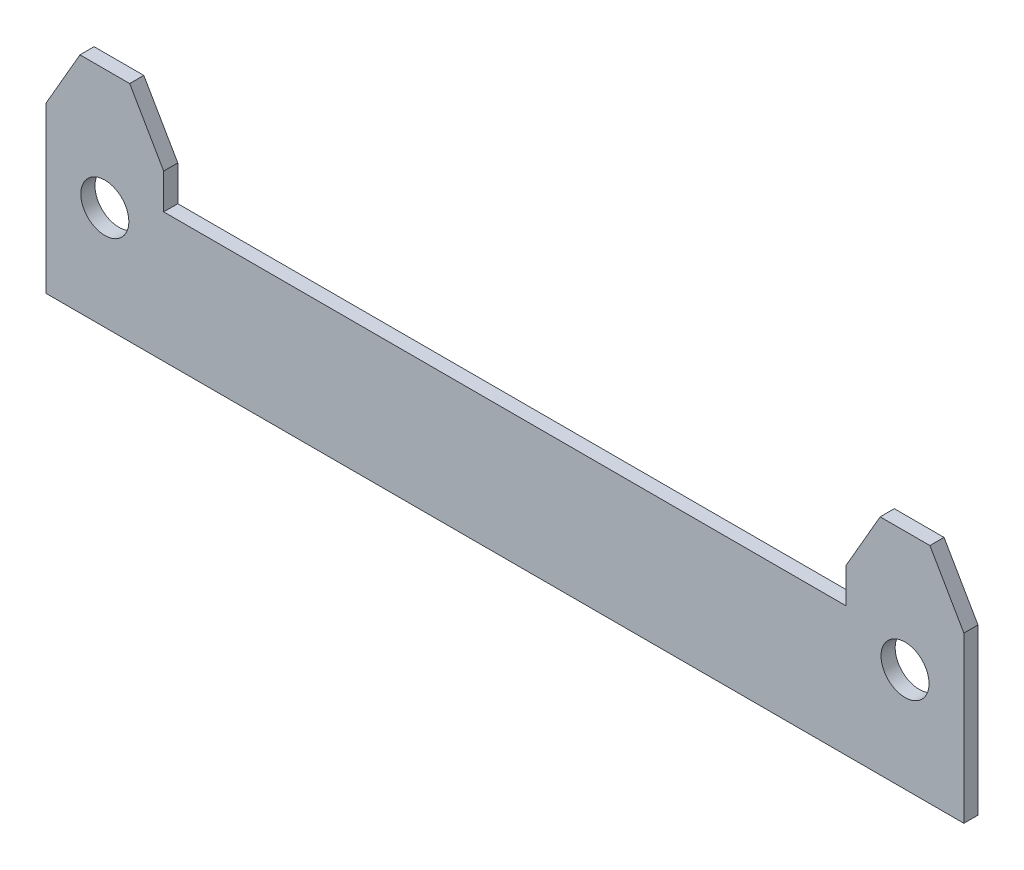
ISO-10303-21;
HEADER;
FILE_DESCRIPTION(('STEP AP214'),'2;1');
FILE_NAME('part.step','',(''),(''),'','','');
FILE_SCHEMA(('AUTOMOTIVE_DESIGN { 1 0 10303 214 1 1 1 1 }'));
ENDSEC;
DATA;
#1=APPLICATION_CONTEXT('core data for automotive mechanical design processes');
#2=APPLICATION_PROTOCOL_DEFINITION('international standard','automotive_design',2000,#1);
#3=PRODUCT_CONTEXT('',#1,'mechanical');
#4=PRODUCT('Part','Part','',(#3));
#5=PRODUCT_RELATED_PRODUCT_CATEGORY('part','',(#4));
#6=PRODUCT_DEFINITION_FORMATION('','',#4);
#7=PRODUCT_DEFINITION_CONTEXT('part definition',#1,'design');
#8=PRODUCT_DEFINITION('design','',#6,#7);
#9=PRODUCT_DEFINITION_SHAPE('','',#8);
#10=(LENGTH_UNIT() NAMED_UNIT(*) SI_UNIT(.MILLI.,.METRE.));
#11=(NAMED_UNIT(*) PLANE_ANGLE_UNIT() SI_UNIT($,.RADIAN.));
#12=(NAMED_UNIT(*) SI_UNIT($,.STERADIAN.) SOLID_ANGLE_UNIT());
#13=UNCERTAINTY_MEASURE_WITH_UNIT(LENGTH_MEASURE(1.E-05),#10,'distance_accuracy_value','');
#14=(GEOMETRIC_REPRESENTATION_CONTEXT(3) GLOBAL_UNCERTAINTY_ASSIGNED_CONTEXT((#13)) GLOBAL_UNIT_ASSIGNED_CONTEXT((#10,
#11,#12)) REPRESENTATION_CONTEXT('',''));
#15=CARTESIAN_POINT('',(0.,0.,0.));
#16=DIRECTION('',(0.,0.,1.));
#17=DIRECTION('',(1.,0.,0.));
#18=AXIS2_PLACEMENT_3D('',#15,#16,#17);
#19=CARTESIAN_POINT('',(0.,0.,3.));
#20=DIRECTION('',(0.,0.,-1.));
#21=DIRECTION('',(-1.,0.,0.));
#22=AXIS2_PLACEMENT_3D('',#19,#20,#21);
#23=PLANE('',#22);
#24=DIRECTION('',(0.,-1.,0.));
#25=VECTOR('',#24,1.);
#26=CARTESIAN_POINT('',(-97.5,0.,3.));
#27=LINE('',#26,#25);
#28=CARTESIAN_POINT('',(-97.5,35.,3.));
#29=VERTEX_POINT('',#28);
#30=CARTESIAN_POINT('',(-97.5,0.,3.));
#31=VERTEX_POINT('',#30);
#32=EDGE_CURVE('E178',#29,#31,#27,.T.);
#33=ORIENTED_EDGE('',*,*,#32,.T.);
#34=DIRECTION('',(1.,0.,0.));
#35=VECTOR('',#34,1.);
#36=CARTESIAN_POINT('',(97.5,0.,3.));
#37=LINE('',#36,#35);
#38=CARTESIAN_POINT('',(97.5,0.,3.));
#39=VERTEX_POINT('',#38);
#40=EDGE_CURVE('E106',#31,#39,#37,.T.);
#41=ORIENTED_EDGE('',*,*,#40,.T.);
#42=DIRECTION('',(0.,1.,0.));
#43=VECTOR('',#42,1.);
#44=CARTESIAN_POINT('',(97.5,0.,3.));
#45=LINE('',#44,#43);
#46=CARTESIAN_POINT('',(97.5,35.,3.));
#47=VERTEX_POINT('',#46);
#48=EDGE_CURVE('E205',#39,#47,#45,.T.);
#49=ORIENTED_EDGE('',*,*,#48,.T.);
#50=DIRECTION('',(-0.499999999999998,0.86602540378444,0.));
#51=VECTOR('',#50,1.);
#52=CARTESIAN_POINT('',(97.5,35.,3.));
#53=LINE('',#52,#51);
#54=CARTESIAN_POINT('',(90.2831216351297,47.5,3.));
#55=VERTEX_POINT('',#54);
#56=EDGE_CURVE('E224',#47,#55,#53,.T.);
#57=ORIENTED_EDGE('',*,*,#56,.T.);
#58=DIRECTION('',(-1.,0.,0.));
#59=VECTOR('',#58,1.);
#60=CARTESIAN_POINT('',(90.2831216351297,47.5,3.));
#61=LINE('',#60,#59);
#62=CARTESIAN_POINT('',(79.7168783648703,47.5,3.));
#63=VERTEX_POINT('',#62);
#64=EDGE_CURVE('E221',#55,#63,#61,.T.);
#65=ORIENTED_EDGE('',*,*,#64,.T.);
#66=DIRECTION('',(-0.499999999999998,-0.86602540378444,0.));
#67=VECTOR('',#66,1.);
#68=CARTESIAN_POINT('',(79.7168783648703,47.5,3.));
#69=LINE('',#68,#67);
#70=CARTESIAN_POINT('',(72.5,35.,3.));
#71=VERTEX_POINT('',#70);
#72=EDGE_CURVE('E223',#63,#71,#69,.T.);
#73=ORIENTED_EDGE('',*,*,#72,.T.);
#74=DIRECTION('',(0.,-1.,0.));
#75=VECTOR('',#74,1.);
#76=CARTESIAN_POINT('',(72.5,35.,3.));
#77=LINE('',#76,#75);
#78=CARTESIAN_POINT('',(72.5,27.5,3.));
#79=VERTEX_POINT('',#78);
#80=EDGE_CURVE('E226',#71,#79,#77,.T.);
#81=ORIENTED_EDGE('',*,*,#80,.T.);
#82=DIRECTION('',(-1.,0.,0.));
#83=VECTOR('',#82,1.);
#84=CARTESIAN_POINT('',(-72.5,27.5,3.));
#85=LINE('',#84,#83);
#86=CARTESIAN_POINT('',(-72.5,27.5,3.));
#87=VERTEX_POINT('',#86);
#88=EDGE_CURVE('E232',#79,#87,#85,.T.);
#89=ORIENTED_EDGE('',*,*,#88,.T.);
#90=DIRECTION('',(0.,1.,0.));
#91=VECTOR('',#90,1.);
#92=CARTESIAN_POINT('',(-72.5,35.,3.));
#93=LINE('',#92,#91);
#94=CARTESIAN_POINT('',(-72.5,35.,3.));
#95=VERTEX_POINT('',#94);
#96=EDGE_CURVE('E137',#87,#95,#93,.T.);
#97=ORIENTED_EDGE('',*,*,#96,.T.);
#98=DIRECTION('',(-0.499999999999998,0.86602540378444,0.));
#99=VECTOR('',#98,1.);
#100=CARTESIAN_POINT('',(-79.7168783648703,47.5,3.));
#101=LINE('',#100,#99);
#102=CARTESIAN_POINT('',(-79.7168783648703,47.5,3.));
#103=VERTEX_POINT('',#102);
#104=EDGE_CURVE('E131',#95,#103,#101,.T.);
#105=ORIENTED_EDGE('',*,*,#104,.T.);
#106=DIRECTION('',(-1.,0.,0.));
#107=VECTOR('',#106,1.);
#108=CARTESIAN_POINT('',(-90.2831216351297,47.5,3.));
#109=LINE('',#108,#107);
#110=CARTESIAN_POINT('',(-90.2831216351297,47.5,3.));
#111=VERTEX_POINT('',#110);
#112=EDGE_CURVE('E135',#103,#111,#109,.T.);
#113=ORIENTED_EDGE('',*,*,#112,.T.);
#114=DIRECTION('',(-0.499999999999998,-0.86602540378444,0.));
#115=VECTOR('',#114,1.);
#116=CARTESIAN_POINT('',(-97.5,35.,3.));
#117=LINE('',#116,#115);
#118=EDGE_CURVE('E51',#111,#29,#117,.T.);
#119=ORIENTED_EDGE('',*,*,#118,.T.);
#120=EDGE_LOOP('',(#33,#41,#49,#57,#65,#73,#81,#89,#97,#105,#113,#119));
#121=FACE_BOUND('',#120,.T.);
#122=CARTESIAN_POINT('',(-85.,22.,3.));
#123=DIRECTION('',(0.,0.,1.));
#124=DIRECTION('',(1.,0.,0.));
#125=AXIS2_PLACEMENT_3D('',#122,#123,#124);
#126=CIRCLE('',#125,5.1);
#127=CARTESIAN_POINT('',(-79.9,22.,3.));
#128=VERTEX_POINT('',#127);
#129=EDGE_CURVE('E159',#128,#128,#126,.T.);
#130=ORIENTED_EDGE('',*,*,#129,.F.);
#131=EDGE_LOOP('',(#130));
#132=FACE_BOUND('',#131,.T.);
#133=CARTESIAN_POINT('',(85.,22.,3.));
#134=DIRECTION('',(0.,0.,1.));
#135=DIRECTION('',(-1.,0.,0.));
#136=AXIS2_PLACEMENT_3D('',#133,#134,#135);
#137=CIRCLE('',#136,5.1);
#138=CARTESIAN_POINT('',(79.9,22.,3.));
#139=VERTEX_POINT('',#138);
#140=EDGE_CURVE('E273',#139,#139,#137,.T.);
#141=ORIENTED_EDGE('',*,*,#140,.F.);
#142=EDGE_LOOP('',(#141));
#143=FACE_BOUND('',#142,.T.);
#144=ADVANCED_FACE('F34',(#121,#132,#143),#23,.F.);
#145=CARTESIAN_POINT('',(0.,0.,0.));
#146=DIRECTION('',(0.,0.,-1.));
#147=DIRECTION('',(-1.,0.,0.));
#148=AXIS2_PLACEMENT_3D('',#145,#146,#147);
#149=PLANE('',#148);
#150=CARTESIAN_POINT('',(-85.,22.,0.));
#151=DIRECTION('',(0.,0.,1.));
#152=DIRECTION('',(1.,0.,0.));
#153=AXIS2_PLACEMENT_3D('',#150,#151,#152);
#154=CIRCLE('',#153,5.1);
#155=CARTESIAN_POINT('',(-79.9,22.,0.));
#156=VERTEX_POINT('',#155);
#157=EDGE_CURVE('E278',#156,#156,#154,.T.);
#158=ORIENTED_EDGE('',*,*,#157,.T.);
#159=EDGE_LOOP('',(#158));
#160=FACE_BOUND('',#159,.T.);
#161=DIRECTION('',(0.,-1.,0.));
#162=VECTOR('',#161,1.);
#163=CARTESIAN_POINT('',(-97.5,0.,0.));
#164=LINE('',#163,#162);
#165=CARTESIAN_POINT('',(-97.5,35.,0.));
#166=VERTEX_POINT('',#165);
#167=CARTESIAN_POINT('',(-97.5,0.,0.));
#168=VERTEX_POINT('',#167);
#169=EDGE_CURVE('E155',#166,#168,#164,.T.);
#170=ORIENTED_EDGE('',*,*,#169,.F.);
#171=DIRECTION('',(-0.499999999999998,-0.86602540378444,0.));
#172=VECTOR('',#171,1.);
#173=CARTESIAN_POINT('',(-97.5,35.,0.));
#174=LINE('',#173,#172);
#175=CARTESIAN_POINT('',(-90.2831216351297,47.5,0.));
#176=VERTEX_POINT('',#175);
#177=EDGE_CURVE('E98',#176,#166,#174,.T.);
#178=ORIENTED_EDGE('',*,*,#177,.F.);
#179=DIRECTION('',(-1.,0.,0.));
#180=VECTOR('',#179,1.);
#181=CARTESIAN_POINT('',(-90.2831216351297,47.5,0.));
#182=LINE('',#181,#180);
#183=CARTESIAN_POINT('',(-79.7168783648703,47.5,0.));
#184=VERTEX_POINT('',#183);
#185=EDGE_CURVE('E92',#184,#176,#182,.T.);
#186=ORIENTED_EDGE('',*,*,#185,.F.);
#187=DIRECTION('',(-0.499999999999998,0.86602540378444,0.));
#188=VECTOR('',#187,1.);
#189=CARTESIAN_POINT('',(-79.7168783648703,47.5,0.));
#190=LINE('',#189,#188);
#191=CARTESIAN_POINT('',(-72.5,35.,0.));
#192=VERTEX_POINT('',#191);
#193=EDGE_CURVE('E145',#192,#184,#190,.T.);
#194=ORIENTED_EDGE('',*,*,#193,.F.);
#195=DIRECTION('',(0.,1.,0.));
#196=VECTOR('',#195,1.);
#197=CARTESIAN_POINT('',(-72.5,35.,0.));
#198=LINE('',#197,#196);
#199=CARTESIAN_POINT('',(-72.5,27.5,0.));
#200=VERTEX_POINT('',#199);
#201=EDGE_CURVE('E173',#200,#192,#198,.T.);
#202=ORIENTED_EDGE('',*,*,#201,.F.);
#203=DIRECTION('',(-1.,0.,0.));
#204=VECTOR('',#203,1.);
#205=CARTESIAN_POINT('',(-72.5,27.5,0.));
#206=LINE('',#205,#204);
#207=CARTESIAN_POINT('',(72.5,27.5,0.));
#208=VERTEX_POINT('',#207);
#209=EDGE_CURVE('E171',#208,#200,#206,.T.);
#210=ORIENTED_EDGE('',*,*,#209,.F.);
#211=DIRECTION('',(0.,-1.,0.));
#212=VECTOR('',#211,1.);
#213=CARTESIAN_POINT('',(72.5,35.,0.));
#214=LINE('',#213,#212);
#215=CARTESIAN_POINT('',(72.5,35.,0.));
#216=VERTEX_POINT('',#215);
#217=EDGE_CURVE('E169',#216,#208,#214,.T.);
#218=ORIENTED_EDGE('',*,*,#217,.F.);
#219=DIRECTION('',(-0.499999999999998,-0.86602540378444,0.));
#220=VECTOR('',#219,1.);
#221=CARTESIAN_POINT('',(79.7168783648703,47.5,0.));
#222=LINE('',#221,#220);
#223=CARTESIAN_POINT('',(79.7168783648703,47.5,0.));
#224=VERTEX_POINT('',#223);
#225=EDGE_CURVE('E167',#224,#216,#222,.T.);
#226=ORIENTED_EDGE('',*,*,#225,.F.);
#227=DIRECTION('',(-1.,0.,0.));
#228=VECTOR('',#227,1.);
#229=CARTESIAN_POINT('',(90.2831216351297,47.5,0.));
#230=LINE('',#229,#228);
#231=CARTESIAN_POINT('',(90.2831216351297,47.5,0.));
#232=VERTEX_POINT('',#231);
#233=EDGE_CURVE('E165',#232,#224,#230,.T.);
#234=ORIENTED_EDGE('',*,*,#233,.F.);
#235=DIRECTION('',(-0.499999999999998,0.86602540378444,0.));
#236=VECTOR('',#235,1.);
#237=CARTESIAN_POINT('',(97.5,35.,0.));
#238=LINE('',#237,#236);
#239=CARTESIAN_POINT('',(97.5,35.,0.));
#240=VERTEX_POINT('',#239);
#241=EDGE_CURVE('E163',#240,#232,#238,.T.);
#242=ORIENTED_EDGE('',*,*,#241,.F.);
#243=DIRECTION('',(0.,1.,0.));
#244=VECTOR('',#243,1.);
#245=CARTESIAN_POINT('',(97.5,0.,0.));
#246=LINE('',#245,#244);
#247=CARTESIAN_POINT('',(97.5,0.,0.));
#248=VERTEX_POINT('',#247);
#249=EDGE_CURVE('E161',#248,#240,#246,.T.);
#250=ORIENTED_EDGE('',*,*,#249,.F.);
#251=DIRECTION('',(1.,0.,0.));
#252=VECTOR('',#251,1.);
#253=CARTESIAN_POINT('',(97.5,0.,0.));
#254=LINE('',#253,#252);
#255=EDGE_CURVE('E158',#168,#248,#254,.T.);
#256=ORIENTED_EDGE('',*,*,#255,.F.);
#257=EDGE_LOOP('',(#170,#178,#186,#194,#202,#210,#218,#226,#234,#242,#250,#256));
#258=FACE_BOUND('',#257,.T.);
#259=CARTESIAN_POINT('',(85.,22.,0.));
#260=DIRECTION('',(0.,0.,1.));
#261=DIRECTION('',(-1.,0.,0.));
#262=AXIS2_PLACEMENT_3D('',#259,#260,#261);
#263=CIRCLE('',#262,5.1);
#264=CARTESIAN_POINT('',(79.9,22.,0.));
#265=VERTEX_POINT('',#264);
#266=EDGE_CURVE('E276',#265,#265,#263,.T.);
#267=ORIENTED_EDGE('',*,*,#266,.T.);
#268=EDGE_LOOP('',(#267));
#269=FACE_BOUND('',#268,.T.);
#270=ADVANCED_FACE('F209',(#160,#258,#269),#149,.T.);
#271=CARTESIAN_POINT('',(-97.5,0.,3.));
#272=DIRECTION('',(1.,0.,0.));
#273=DIRECTION('',(0.,0.,-1.));
#274=AXIS2_PLACEMENT_3D('',#271,#272,#273);
#275=PLANE('',#274);
#276=ORIENTED_EDGE('',*,*,#169,.T.);
#277=DIRECTION('',(0.,0.,-1.));
#278=VECTOR('',#277,1.);
#279=CARTESIAN_POINT('',(-97.5,0.,3.));
#280=LINE('',#279,#278);
#281=EDGE_CURVE('E11',#31,#168,#280,.T.);
#282=ORIENTED_EDGE('',*,*,#281,.F.);
#283=ORIENTED_EDGE('',*,*,#32,.F.);
#284=DIRECTION('',(0.,0.,-1.));
#285=VECTOR('',#284,1.);
#286=CARTESIAN_POINT('',(-97.5,35.,3.));
#287=LINE('',#286,#285);
#288=EDGE_CURVE('E151',#29,#166,#287,.T.);
#289=ORIENTED_EDGE('',*,*,#288,.T.);
#290=EDGE_LOOP('',(#276,#282,#283,#289));
#291=FACE_BOUND('',#290,.T.);
#292=ADVANCED_FACE('F36',(#291),#275,.F.);
#293=CARTESIAN_POINT('',(97.5,0.,3.));
#294=DIRECTION('',(0.,1.,0.));
#295=DIRECTION('',(-1.,0.,0.));
#296=AXIS2_PLACEMENT_3D('',#293,#294,#295);
#297=PLANE('',#296);
#298=ORIENTED_EDGE('',*,*,#255,.T.);
#299=DIRECTION('',(0.,0.,-1.));
#300=VECTOR('',#299,1.);
#301=CARTESIAN_POINT('',(97.5,0.,3.));
#302=LINE('',#301,#300);
#303=EDGE_CURVE('E43',#39,#248,#302,.T.);
#304=ORIENTED_EDGE('',*,*,#303,.F.);
#305=ORIENTED_EDGE('',*,*,#40,.F.);
#306=ORIENTED_EDGE('',*,*,#281,.T.);
#307=EDGE_LOOP('',(#298,#304,#305,#306));
#308=FACE_BOUND('',#307,.T.);
#309=ADVANCED_FACE('F373',(#308),#297,.F.);
#310=CARTESIAN_POINT('',(97.5,0.,3.));
#311=DIRECTION('',(-1.,0.,0.));
#312=DIRECTION('',(0.,0.,1.));
#313=AXIS2_PLACEMENT_3D('',#310,#311,#312);
#314=PLANE('',#313);
#315=ORIENTED_EDGE('',*,*,#249,.T.);
#316=DIRECTION('',(0.,0.,-1.));
#317=VECTOR('',#316,1.);
#318=CARTESIAN_POINT('',(97.5,35.,3.));
#319=LINE('',#318,#317);
#320=EDGE_CURVE('E197',#47,#240,#319,.T.);
#321=ORIENTED_EDGE('',*,*,#320,.F.);
#322=ORIENTED_EDGE('',*,*,#48,.F.);
#323=ORIENTED_EDGE('',*,*,#303,.T.);
#324=EDGE_LOOP('',(#315,#321,#322,#323));
#325=FACE_BOUND('',#324,.T.);
#326=ADVANCED_FACE('F203',(#325),#314,.F.);
#327=CARTESIAN_POINT('',(97.5,35.,3.));
#328=DIRECTION('',(-0.86602540378444,-0.499999999999998,0.));
#329=DIRECTION('',(0.499999999999998,-0.86602540378444,0.));
#330=AXIS2_PLACEMENT_3D('',#327,#328,#329);
#331=PLANE('',#330);
#332=ORIENTED_EDGE('',*,*,#241,.T.);
#333=DIRECTION('',(0.,0.,-1.));
#334=VECTOR('',#333,1.);
#335=CARTESIAN_POINT('',(90.2831216351297,47.5,3.));
#336=LINE('',#335,#334);
#337=EDGE_CURVE('E194',#55,#232,#336,.T.);
#338=ORIENTED_EDGE('',*,*,#337,.F.);
#339=ORIENTED_EDGE('',*,*,#56,.F.);
#340=ORIENTED_EDGE('',*,*,#320,.T.);
#341=EDGE_LOOP('',(#332,#338,#339,#340));
#342=FACE_BOUND('',#341,.T.);
#343=ADVANCED_FACE('F215',(#342),#331,.F.);
#344=CARTESIAN_POINT('',(90.2831216351297,47.5,3.));
#345=DIRECTION('',(0.,-1.,0.));
#346=DIRECTION('',(0.,0.,-1.));
#347=AXIS2_PLACEMENT_3D('',#344,#345,#346);
#348=PLANE('',#347);
#349=ORIENTED_EDGE('',*,*,#233,.T.);
#350=DIRECTION('',(0.,0.,-1.));
#351=VECTOR('',#350,1.);
#352=CARTESIAN_POINT('',(79.7168783648703,47.5,3.));
#353=LINE('',#352,#351);
#354=EDGE_CURVE('E191',#63,#224,#353,.T.);
#355=ORIENTED_EDGE('',*,*,#354,.F.);
#356=ORIENTED_EDGE('',*,*,#64,.F.);
#357=ORIENTED_EDGE('',*,*,#337,.T.);
#358=EDGE_LOOP('',(#349,#355,#356,#357));
#359=FACE_BOUND('',#358,.T.);
#360=ADVANCED_FACE('F219',(#359),#348,.F.);
#361=CARTESIAN_POINT('',(79.7168783648703,47.5,3.));
#362=DIRECTION('',(0.86602540378444,-0.499999999999998,0.));
#363=DIRECTION('',(0.499999999999998,0.86602540378444,0.));
#364=AXIS2_PLACEMENT_3D('',#361,#362,#363);
#365=PLANE('',#364);
#366=ORIENTED_EDGE('',*,*,#225,.T.);
#367=DIRECTION('',(0.,0.,-1.));
#368=VECTOR('',#367,1.);
#369=CARTESIAN_POINT('',(72.5,35.,3.));
#370=LINE('',#369,#368);
#371=EDGE_CURVE('E188',#71,#216,#370,.T.);
#372=ORIENTED_EDGE('',*,*,#371,.F.);
#373=ORIENTED_EDGE('',*,*,#72,.F.);
#374=ORIENTED_EDGE('',*,*,#354,.T.);
#375=EDGE_LOOP('',(#366,#372,#373,#374));
#376=FACE_BOUND('',#375,.T.);
#377=ADVANCED_FACE('F338',(#376),#365,.F.);
#378=CARTESIAN_POINT('',(72.5,35.,3.));
#379=DIRECTION('',(1.,0.,0.));
#380=DIRECTION('',(0.,0.,-1.));
#381=AXIS2_PLACEMENT_3D('',#378,#379,#380);
#382=PLANE('',#381);
#383=ORIENTED_EDGE('',*,*,#217,.T.);
#384=DIRECTION('',(0.,0.,-1.));
#385=VECTOR('',#384,1.);
#386=CARTESIAN_POINT('',(72.5,27.5,3.));
#387=LINE('',#386,#385);
#388=EDGE_CURVE('E185',#79,#208,#387,.T.);
#389=ORIENTED_EDGE('',*,*,#388,.F.);
#390=ORIENTED_EDGE('',*,*,#80,.F.);
#391=ORIENTED_EDGE('',*,*,#371,.T.);
#392=EDGE_LOOP('',(#383,#389,#390,#391));
#393=FACE_BOUND('',#392,.T.);
#394=ADVANCED_FACE('F329',(#393),#382,.F.);
#395=CARTESIAN_POINT('',(-72.5,27.5,3.));
#396=DIRECTION('',(0.,-1.,0.));
#397=DIRECTION('',(1.,0.,0.));
#398=AXIS2_PLACEMENT_3D('',#395,#396,#397);
#399=PLANE('',#398);
#400=ORIENTED_EDGE('',*,*,#209,.T.);
#401=DIRECTION('',(0.,0.,-1.));
#402=VECTOR('',#401,1.);
#403=CARTESIAN_POINT('',(-72.5,27.5,3.));
#404=LINE('',#403,#402);
#405=EDGE_CURVE('E182',#87,#200,#404,.T.);
#406=ORIENTED_EDGE('',*,*,#405,.F.);
#407=ORIENTED_EDGE('',*,*,#88,.F.);
#408=ORIENTED_EDGE('',*,*,#388,.T.);
#409=EDGE_LOOP('',(#400,#406,#407,#408));
#410=FACE_BOUND('',#409,.T.);
#411=ADVANCED_FACE('F238',(#410),#399,.F.);
#412=CARTESIAN_POINT('',(-72.5,35.,3.));
#413=DIRECTION('',(-1.,0.,0.));
#414=DIRECTION('',(0.,0.,1.));
#415=AXIS2_PLACEMENT_3D('',#412,#413,#414);
#416=PLANE('',#415);
#417=ORIENTED_EDGE('',*,*,#201,.T.);
#418=DIRECTION('',(0.,0.,-1.));
#419=VECTOR('',#418,1.);
#420=CARTESIAN_POINT('',(-72.5,35.,3.));
#421=LINE('',#420,#419);
#422=EDGE_CURVE('E146',#95,#192,#421,.T.);
#423=ORIENTED_EDGE('',*,*,#422,.F.);
#424=ORIENTED_EDGE('',*,*,#96,.F.);
#425=ORIENTED_EDGE('',*,*,#405,.T.);
#426=EDGE_LOOP('',(#417,#423,#424,#425));
#427=FACE_BOUND('',#426,.T.);
#428=ADVANCED_FACE('F242',(#427),#416,.F.);
#429=CARTESIAN_POINT('',(-79.7168783648703,47.5,3.));
#430=DIRECTION('',(-0.86602540378444,-0.499999999999998,0.));
#431=DIRECTION('',(0.499999999999998,-0.86602540378444,0.));
#432=AXIS2_PLACEMENT_3D('',#429,#430,#431);
#433=PLANE('',#432);
#434=ORIENTED_EDGE('',*,*,#193,.T.);
#435=DIRECTION('',(0.,0.,-1.));
#436=VECTOR('',#435,1.);
#437=CARTESIAN_POINT('',(-79.7168783648703,47.5,3.));
#438=LINE('',#437,#436);
#439=EDGE_CURVE('E142',#103,#184,#438,.T.);
#440=ORIENTED_EDGE('',*,*,#439,.F.);
#441=ORIENTED_EDGE('',*,*,#104,.F.);
#442=ORIENTED_EDGE('',*,*,#422,.T.);
#443=EDGE_LOOP('',(#434,#440,#441,#442));
#444=FACE_BOUND('',#443,.T.);
#445=ADVANCED_FACE('F143',(#444),#433,.F.);
#446=CARTESIAN_POINT('',(-90.2831216351297,47.5,3.));
#447=DIRECTION('',(0.,-1.,0.));
#448=DIRECTION('',(1.,0.,0.));
#449=AXIS2_PLACEMENT_3D('',#446,#447,#448);
#450=PLANE('',#449);
#451=ORIENTED_EDGE('',*,*,#185,.T.);
#452=DIRECTION('',(0.,0.,-1.));
#453=VECTOR('',#452,1.);
#454=CARTESIAN_POINT('',(-90.2831216351297,47.5,3.));
#455=LINE('',#454,#453);
#456=EDGE_CURVE('E147',#111,#176,#455,.T.);
#457=ORIENTED_EDGE('',*,*,#456,.F.);
#458=ORIENTED_EDGE('',*,*,#112,.F.);
#459=ORIENTED_EDGE('',*,*,#439,.T.);
#460=EDGE_LOOP('',(#451,#457,#458,#459));
#461=FACE_BOUND('',#460,.T.);
#462=ADVANCED_FACE('F149',(#461),#450,.F.);
#463=CARTESIAN_POINT('',(-97.5,35.,3.));
#464=DIRECTION('',(0.86602540378444,-0.499999999999998,0.));
#465=DIRECTION('',(0.499999999999998,0.86602540378444,0.));
#466=AXIS2_PLACEMENT_3D('',#463,#464,#465);
#467=PLANE('',#466);
#468=ORIENTED_EDGE('',*,*,#177,.T.);
#469=ORIENTED_EDGE('',*,*,#288,.F.);
#470=ORIENTED_EDGE('',*,*,#118,.F.);
#471=ORIENTED_EDGE('',*,*,#456,.T.);
#472=EDGE_LOOP('',(#468,#469,#470,#471));
#473=FACE_BOUND('',#472,.T.);
#474=ADVANCED_FACE('F246',(#473),#467,.F.);
#475=CARTESIAN_POINT('',(-85.,22.,3.));
#476=DIRECTION('',(0.,0.,-1.));
#477=DIRECTION('',(-1.,0.,0.));
#478=AXIS2_PLACEMENT_3D('',#475,#476,#477);
#479=CYLINDRICAL_SURFACE('',#478,5.1);
#480=ORIENTED_EDGE('',*,*,#129,.T.);
#481=EDGE_LOOP('',(#480));
#482=FACE_BOUND('',#481,.T.);
#483=ORIENTED_EDGE('',*,*,#157,.F.);
#484=EDGE_LOOP('',(#483));
#485=FACE_BOUND('',#484,.T.);
#486=ADVANCED_FACE('F248',(#482,#485),#479,.F.);
#487=CARTESIAN_POINT('',(85.,22.,3.));
#488=DIRECTION('',(0.,0.,-1.));
#489=DIRECTION('',(-1.,0.,0.));
#490=AXIS2_PLACEMENT_3D('',#487,#488,#489);
#491=CYLINDRICAL_SURFACE('',#490,5.1);
#492=ORIENTED_EDGE('',*,*,#140,.T.);
#493=EDGE_LOOP('',(#492));
#494=FACE_BOUND('',#493,.T.);
#495=ORIENTED_EDGE('',*,*,#266,.F.);
#496=EDGE_LOOP('',(#495));
#497=FACE_BOUND('',#496,.T.);
#498=ADVANCED_FACE('F254',(#494,#497),#491,.F.);
#499=CLOSED_SHELL('',(#144,#270,#292,#309,#326,#343,#360,#377,#394,#411,#428,#445,#462,#474,
#486,#498));
#500=MANIFOLD_SOLID_BREP('B2',#499);
#501=ADVANCED_BREP_SHAPE_REPRESENTATION('',(#18,#500),#14);
#502=SHAPE_DEFINITION_REPRESENTATION(#9,#501);
ENDSEC;
END-ISO-10303-21;
